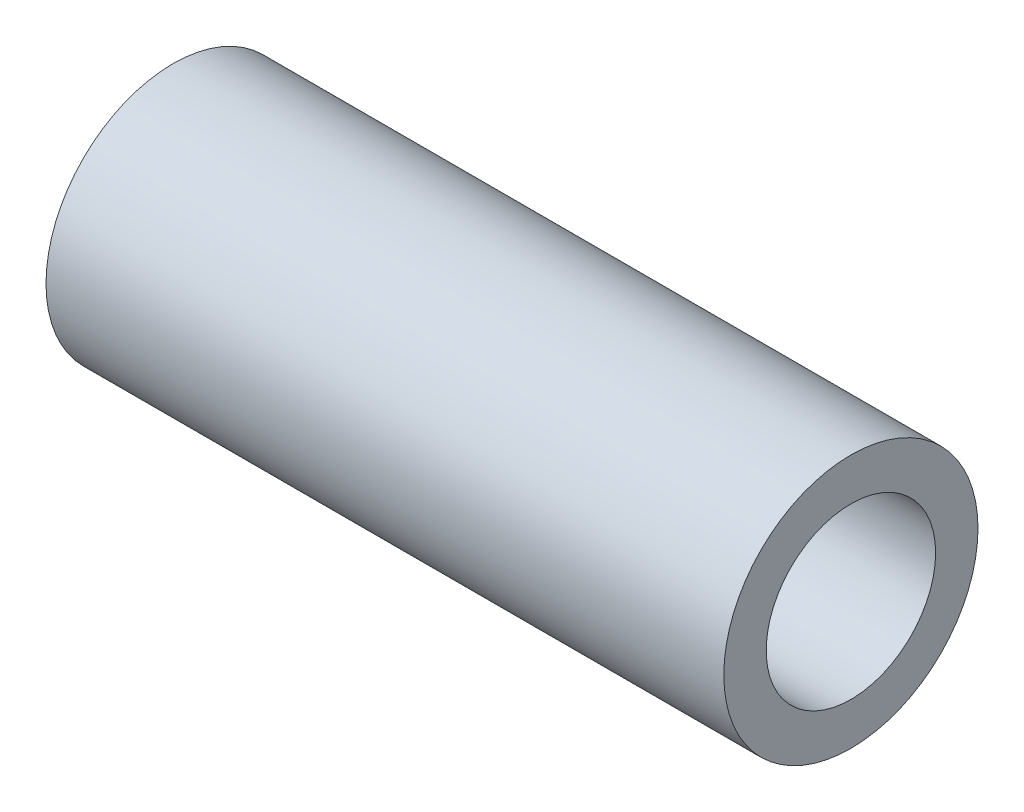
ISO-10303-21;
HEADER;
FILE_DESCRIPTION(('STEP AP214'),'2;1');
FILE_NAME('part.step','',(''),(''),'','','');
FILE_SCHEMA(('AUTOMOTIVE_DESIGN { 1 0 10303 214 1 1 1 1 }'));
ENDSEC;
DATA;
#1=APPLICATION_CONTEXT('core data for automotive mechanical design processes');
#2=APPLICATION_PROTOCOL_DEFINITION('international standard','automotive_design',2000,#1);
#3=PRODUCT_CONTEXT('',#1,'mechanical');
#4=PRODUCT('Part','Part','',(#3));
#5=PRODUCT_RELATED_PRODUCT_CATEGORY('part','',(#4));
#6=PRODUCT_DEFINITION_FORMATION('','',#4);
#7=PRODUCT_DEFINITION_CONTEXT('part definition',#1,'design');
#8=PRODUCT_DEFINITION('design','',#6,#7);
#9=PRODUCT_DEFINITION_SHAPE('','',#8);
#10=(LENGTH_UNIT() NAMED_UNIT(*) SI_UNIT(.MILLI.,.METRE.));
#11=(NAMED_UNIT(*) PLANE_ANGLE_UNIT() SI_UNIT($,.RADIAN.));
#12=(NAMED_UNIT(*) SI_UNIT($,.STERADIAN.) SOLID_ANGLE_UNIT());
#13=UNCERTAINTY_MEASURE_WITH_UNIT(LENGTH_MEASURE(1.E-05),#10,'distance_accuracy_value','');
#14=(GEOMETRIC_REPRESENTATION_CONTEXT(3) GLOBAL_UNCERTAINTY_ASSIGNED_CONTEXT((#13)) GLOBAL_UNIT_ASSIGNED_CONTEXT((#10,
#11,#12)) REPRESENTATION_CONTEXT('',''));
#15=CARTESIAN_POINT('',(0.,0.,0.));
#16=DIRECTION('',(0.,0.,1.));
#17=DIRECTION('',(1.,0.,0.));
#18=AXIS2_PLACEMENT_3D('',#15,#16,#17);
#19=CARTESIAN_POINT('',(25.4,0.,0.));
#20=DIRECTION('',(1.,0.,0.));
#21=DIRECTION('',(0.,0.,-1.));
#22=AXIS2_PLACEMENT_3D('',#19,#20,#21);
#23=PLANE('',#22);
#24=CARTESIAN_POINT('',(25.4,0.,0.));
#25=DIRECTION('',(1.,0.,0.));
#26=DIRECTION('',(0.,0.,-1.));
#27=AXIS2_PLACEMENT_3D('',#24,#25,#26);
#28=CIRCLE('',#27,4.7625);
#29=CARTESIAN_POINT('',(25.4,0.,-4.7625));
#30=VERTEX_POINT('',#29);
#31=EDGE_CURVE('E10',#30,#30,#28,.T.);
#32=ORIENTED_EDGE('',*,*,#31,.T.);
#33=EDGE_LOOP('',(#32));
#34=FACE_BOUND('',#33,.T.);
#35=CARTESIAN_POINT('',(25.4,0.,0.));
#36=DIRECTION('',(1.,0.,0.));
#37=DIRECTION('',(0.,0.,-1.));
#38=AXIS2_PLACEMENT_3D('',#35,#36,#37);
#39=CIRCLE('',#38,3.175);
#40=CARTESIAN_POINT('',(25.4,0.,-3.175));
#41=VERTEX_POINT('',#40);
#42=EDGE_CURVE('E42',#41,#41,#39,.T.);
#43=ORIENTED_EDGE('',*,*,#42,.F.);
#44=EDGE_LOOP('',(#43));
#45=FACE_BOUND('',#44,.T.);
#46=ADVANCED_FACE('F31',(#34,#45),#23,.T.);
#47=CARTESIAN_POINT('',(0.,0.,0.));
#48=DIRECTION('',(1.,0.,0.));
#49=DIRECTION('',(0.,0.,-1.));
#50=AXIS2_PLACEMENT_3D('',#47,#48,#49);
#51=PLANE('',#50);
#52=CARTESIAN_POINT('',(0.,0.,0.));
#53=DIRECTION('',(1.,0.,0.));
#54=DIRECTION('',(0.,0.,-1.));
#55=AXIS2_PLACEMENT_3D('',#52,#53,#54);
#56=CIRCLE('',#55,4.7625);
#57=CARTESIAN_POINT('',(0.,0.,-4.7625));
#58=VERTEX_POINT('',#57);
#59=EDGE_CURVE('E35',#58,#58,#56,.T.);
#60=ORIENTED_EDGE('',*,*,#59,.F.);
#61=EDGE_LOOP('',(#60));
#62=FACE_BOUND('',#61,.T.);
#63=CARTESIAN_POINT('',(0.,0.,0.));
#64=DIRECTION('',(1.,0.,0.));
#65=DIRECTION('',(0.,0.,-1.));
#66=AXIS2_PLACEMENT_3D('',#63,#64,#65);
#67=CIRCLE('',#66,3.175);
#68=CARTESIAN_POINT('',(0.,0.,-3.175));
#69=VERTEX_POINT('',#68);
#70=EDGE_CURVE('E44',#69,#69,#67,.T.);
#71=ORIENTED_EDGE('',*,*,#70,.T.);
#72=EDGE_LOOP('',(#71));
#73=FACE_BOUND('',#72,.T.);
#74=ADVANCED_FACE('F54',(#62,#73),#51,.F.);
#75=CARTESIAN_POINT('',(25.4,0.,0.));
#76=DIRECTION('',(-1.,0.,0.));
#77=DIRECTION('',(0.,0.,1.));
#78=AXIS2_PLACEMENT_3D('',#75,#76,#77);
#79=CYLINDRICAL_SURFACE('',#78,4.7625);
#80=ORIENTED_EDGE('',*,*,#31,.F.);
#81=EDGE_LOOP('',(#80));
#82=FACE_BOUND('',#81,.T.);
#83=ORIENTED_EDGE('',*,*,#59,.T.);
#84=EDGE_LOOP('',(#83));
#85=FACE_BOUND('',#84,.T.);
#86=ADVANCED_FACE('F33',(#82,#85),#79,.T.);
#87=CARTESIAN_POINT('',(25.4,0.,0.));
#88=DIRECTION('',(-1.,0.,0.));
#89=DIRECTION('',(0.,0.,1.));
#90=AXIS2_PLACEMENT_3D('',#87,#88,#89);
#91=CYLINDRICAL_SURFACE('',#90,3.175);
#92=ORIENTED_EDGE('',*,*,#42,.T.);
#93=EDGE_LOOP('',(#92));
#94=FACE_BOUND('',#93,.T.);
#95=ORIENTED_EDGE('',*,*,#70,.F.);
#96=EDGE_LOOP('',(#95));
#97=FACE_BOUND('',#96,.T.);
#98=ADVANCED_FACE('F50',(#94,#97),#91,.F.);
#99=CLOSED_SHELL('',(#46,#74,#86,#98));
#100=MANIFOLD_SOLID_BREP('B2',#99);
#101=ADVANCED_BREP_SHAPE_REPRESENTATION('',(#18,#100),#14);
#102=SHAPE_DEFINITION_REPRESENTATION(#9,#101);
ENDSEC;
END-ISO-10303-21;
